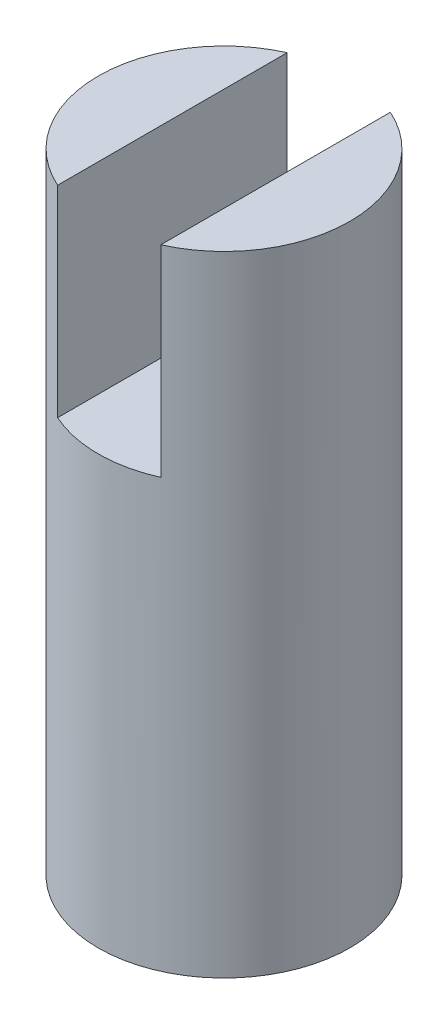
ISO-10303-21;
HEADER;
FILE_DESCRIPTION(('STEP AP214'),'2;1');
FILE_NAME('part.step','',(''),(''),'','','');
FILE_SCHEMA(('AUTOMOTIVE_DESIGN { 1 0 10303 214 1 1 1 1 }'));
ENDSEC;
DATA;
#1=APPLICATION_CONTEXT('core data for automotive mechanical design processes');
#2=APPLICATION_PROTOCOL_DEFINITION('international standard','automotive_design',2000,#1);
#3=PRODUCT_CONTEXT('',#1,'mechanical');
#4=PRODUCT('Part','Part','',(#3));
#5=PRODUCT_RELATED_PRODUCT_CATEGORY('part','',(#4));
#6=PRODUCT_DEFINITION_FORMATION('','',#4);
#7=PRODUCT_DEFINITION_CONTEXT('part definition',#1,'design');
#8=PRODUCT_DEFINITION('design','',#6,#7);
#9=PRODUCT_DEFINITION_SHAPE('','',#8);
#10=(LENGTH_UNIT() NAMED_UNIT(*) SI_UNIT(.MILLI.,.METRE.));
#11=(NAMED_UNIT(*) PLANE_ANGLE_UNIT() SI_UNIT($,.RADIAN.));
#12=(NAMED_UNIT(*) SI_UNIT($,.STERADIAN.) SOLID_ANGLE_UNIT());
#13=UNCERTAINTY_MEASURE_WITH_UNIT(LENGTH_MEASURE(1.E-05),#10,'distance_accuracy_value','');
#14=(GEOMETRIC_REPRESENTATION_CONTEXT(3) GLOBAL_UNCERTAINTY_ASSIGNED_CONTEXT((#13)) GLOBAL_UNIT_ASSIGNED_CONTEXT((#10,
#11,#12)) REPRESENTATION_CONTEXT('',''));
#15=CARTESIAN_POINT('',(0.,0.,0.));
#16=DIRECTION('',(0.,0.,1.));
#17=DIRECTION('',(1.,0.,0.));
#18=AXIS2_PLACEMENT_3D('',#15,#16,#17);
#19=CARTESIAN_POINT('',(0.,25.,0.));
#20=DIRECTION('',(0.,1.,0.));
#21=DIRECTION('',(0.,0.,1.));
#22=AXIS2_PLACEMENT_3D('',#19,#20,#21);
#23=PLANE('',#22);
#24=DIRECTION('',(0.,0.,-1.));
#25=VECTOR('',#24,1.);
#26=CARTESIAN_POINT('',(2.05,25.,0.));
#27=LINE('',#26,#25);
#28=CARTESIAN_POINT('',(2.05,25.,4.56042761152943));
#29=VERTEX_POINT('',#28);
#30=CARTESIAN_POINT('',(2.05,25.,-4.56042761152943));
#31=VERTEX_POINT('',#30);
#32=EDGE_CURVE('E158',#29,#31,#27,.T.);
#33=ORIENTED_EDGE('',*,*,#32,.F.);
#34=CARTESIAN_POINT('',(0.,25.,0.));
#35=DIRECTION('',(0.,1.,0.));
#36=DIRECTION('',(0.,0.,1.));
#37=AXIS2_PLACEMENT_3D('',#34,#35,#36);
#38=CIRCLE('',#37,5.);
#39=EDGE_CURVE('E151',#29,#31,#38,.T.);
#40=ORIENTED_EDGE('',*,*,#39,.T.);
#41=EDGE_LOOP('',(#33,#40));
#42=FACE_BOUND('',#41,.T.);
#43=ADVANCED_FACE('F33',(#42),#23,.T.);
#44=CARTESIAN_POINT('',(0.,25.,0.));
#45=DIRECTION('',(0.,-1.,0.));
#46=DIRECTION('',(0.,0.,-1.));
#47=AXIS2_PLACEMENT_3D('',#44,#45,#46);
#48=CYLINDRICAL_SURFACE('',#47,5.);
#49=CARTESIAN_POINT('',(0.,17.,0.));
#50=DIRECTION('',(0.,1.,0.));
#51=DIRECTION('',(0.,0.,1.));
#52=AXIS2_PLACEMENT_3D('',#49,#50,#51);
#53=CIRCLE('',#52,5.);
#54=CARTESIAN_POINT('',(2.05,17.,-4.56042761152943));
#55=VERTEX_POINT('',#54);
#56=CARTESIAN_POINT('',(-2.05,17.,-4.56042761152943));
#57=VERTEX_POINT('',#56);
#58=EDGE_CURVE('E11',#55,#57,#53,.T.);
#59=ORIENTED_EDGE('',*,*,#58,.F.);
#60=DIRECTION('',(0.,-1.,0.));
#61=VECTOR('',#60,1.);
#62=CARTESIAN_POINT('',(2.05,25.,-4.56042761152943));
#63=LINE('',#62,#61);
#64=EDGE_CURVE('E144',#55,#31,#63,.F.);
#65=ORIENTED_EDGE('',*,*,#64,.T.);
#66=ORIENTED_EDGE('',*,*,#39,.F.);
#67=DIRECTION('',(0.,-1.,0.));
#68=VECTOR('',#67,1.);
#69=CARTESIAN_POINT('',(2.05,25.,4.56042761152943));
#70=LINE('',#69,#68);
#71=CARTESIAN_POINT('',(2.05,17.,4.56042761152943));
#72=VERTEX_POINT('',#71);
#73=EDGE_CURVE('E147',#29,#72,#70,.T.);
#74=ORIENTED_EDGE('',*,*,#73,.T.);
#75=CARTESIAN_POINT('',(-2.05,17.,4.56042761152943));
#76=VERTEX_POINT('',#75);
#77=EDGE_CURVE('E37',#76,#72,#53,.T.);
#78=ORIENTED_EDGE('',*,*,#77,.F.);
#79=DIRECTION('',(0.,-1.,0.));
#80=VECTOR('',#79,1.);
#81=CARTESIAN_POINT('',(-2.05,25.,4.56042761152943));
#82=LINE('',#81,#80);
#83=CARTESIAN_POINT('',(-2.05,25.,4.56042761152943));
#84=VERTEX_POINT('',#83);
#85=EDGE_CURVE('E140',#76,#84,#82,.F.);
#86=ORIENTED_EDGE('',*,*,#85,.T.);
#87=CARTESIAN_POINT('',(-2.05,25.,-4.56042761152943));
#88=VERTEX_POINT('',#87);
#89=EDGE_CURVE('E155',#88,#84,#38,.T.);
#90=ORIENTED_EDGE('',*,*,#89,.F.);
#91=DIRECTION('',(0.,-1.,0.));
#92=VECTOR('',#91,1.);
#93=CARTESIAN_POINT('',(-2.05,25.,-4.56042761152943));
#94=LINE('',#93,#92);
#95=EDGE_CURVE('E56',#88,#57,#94,.T.);
#96=ORIENTED_EDGE('',*,*,#95,.T.);
#97=EDGE_LOOP('',(#59,#65,#66,#74,#78,#86,#90,#96));
#98=FACE_BOUND('',#97,.T.);
#99=CARTESIAN_POINT('',(0.,0.,0.));
#100=DIRECTION('',(0.,1.,0.));
#101=DIRECTION('',(0.,0.,1.));
#102=AXIS2_PLACEMENT_3D('',#99,#100,#101);
#103=CIRCLE('',#102,5.);
#104=CARTESIAN_POINT('',(0.,0.,5.));
#105=VERTEX_POINT('',#104);
#106=EDGE_CURVE('E150',#105,#105,#103,.T.);
#107=ORIENTED_EDGE('',*,*,#106,.T.);
#108=EDGE_LOOP('',(#107));
#109=FACE_BOUND('',#108,.T.);
#110=ADVANCED_FACE('F35',(#98,#109),#48,.T.);
#111=DIRECTION('',(0.,0.,1.));
#112=VECTOR('',#111,1.);
#113=CARTESIAN_POINT('',(-2.05,25.,0.));
#114=LINE('',#113,#112);
#115=EDGE_CURVE('E154',#88,#84,#114,.T.);
#116=ORIENTED_EDGE('',*,*,#115,.F.);
#117=ORIENTED_EDGE('',*,*,#89,.T.);
#118=EDGE_LOOP('',(#116,#117));
#119=FACE_BOUND('',#118,.T.);
#120=ADVANCED_FACE('F173',(#119),#23,.T.);
#121=CARTESIAN_POINT('',(0.,0.,0.));
#122=DIRECTION('',(0.,1.,0.));
#123=DIRECTION('',(0.,0.,1.));
#124=AXIS2_PLACEMENT_3D('',#121,#122,#123);
#125=PLANE('',#124);
#126=CARTESIAN_POINT('',(0.,0.,0.));
#127=DIRECTION('',(0.,-1.,0.));
#128=DIRECTION('',(0.,0.,-1.));
#129=AXIS2_PLACEMENT_3D('',#126,#127,#128);
#130=CIRCLE('',#129,3.05);
#131=CARTESIAN_POINT('',(-2.3,0.,-2.00312256240101));
#132=VERTEX_POINT('',#131);
#133=CARTESIAN_POINT('',(2.3,0.,-2.00312256240101));
#134=VERTEX_POINT('',#133);
#135=EDGE_CURVE('E123',#132,#134,#130,.T.);
#136=ORIENTED_EDGE('',*,*,#135,.F.);
#137=DIRECTION('',(0.,0.,-1.));
#138=VECTOR('',#137,1.);
#139=CARTESIAN_POINT('',(-2.3,0.,0.));
#140=LINE('',#139,#138);
#141=CARTESIAN_POINT('',(-2.3,0.,2.00312256240101));
#142=VERTEX_POINT('',#141);
#143=EDGE_CURVE('E48',#142,#132,#140,.T.);
#144=ORIENTED_EDGE('',*,*,#143,.F.);
#145=CARTESIAN_POINT('',(2.3,0.,2.00312256240101));
#146=VERTEX_POINT('',#145);
#147=EDGE_CURVE('E118',#146,#142,#130,.T.);
#148=ORIENTED_EDGE('',*,*,#147,.F.);
#149=DIRECTION('',(0.,0.,-1.));
#150=VECTOR('',#149,1.);
#151=CARTESIAN_POINT('',(2.3,0.,0.));
#152=LINE('',#151,#150);
#153=EDGE_CURVE('E121',#146,#134,#152,.T.);
#154=ORIENTED_EDGE('',*,*,#153,.T.);
#155=EDGE_LOOP('',(#136,#144,#148,#154));
#156=FACE_BOUND('',#155,.T.);
#157=ORIENTED_EDGE('',*,*,#106,.F.);
#158=EDGE_LOOP('',(#157));
#159=FACE_BOUND('',#158,.T.);
#160=ADVANCED_FACE('F179',(#156,#159),#125,.F.);
#161=CARTESIAN_POINT('',(0.,17.,0.));
#162=DIRECTION('',(0.,1.,0.));
#163=DIRECTION('',(0.,0.,1.));
#164=AXIS2_PLACEMENT_3D('',#161,#162,#163);
#165=PLANE('',#164);
#166=ORIENTED_EDGE('',*,*,#58,.T.);
#167=DIRECTION('',(0.,0.,1.));
#168=VECTOR('',#167,1.);
#169=CARTESIAN_POINT('',(-2.05,17.,-5.24793317822514));
#170=LINE('',#169,#168);
#171=EDGE_CURVE('E137',#57,#76,#170,.T.);
#172=ORIENTED_EDGE('',*,*,#171,.T.);
#173=ORIENTED_EDGE('',*,*,#77,.T.);
#174=DIRECTION('',(0.,0.,-1.));
#175=VECTOR('',#174,1.);
#176=CARTESIAN_POINT('',(2.05,17.,-5.24793317822514));
#177=LINE('',#176,#175);
#178=EDGE_CURVE('E131',#72,#55,#177,.T.);
#179=ORIENTED_EDGE('',*,*,#178,.T.);
#180=EDGE_LOOP('',(#166,#172,#173,#179));
#181=FACE_BOUND('',#180,.T.);
#182=ADVANCED_FACE('F164',(#181),#165,.T.);
#183=CARTESIAN_POINT('',(2.05,17.,-5.24793317822514));
#184=DIRECTION('',(1.,0.,0.));
#185=DIRECTION('',(0.,0.,-1.));
#186=AXIS2_PLACEMENT_3D('',#183,#184,#185);
#187=PLANE('',#186);
#188=ORIENTED_EDGE('',*,*,#32,.T.);
#189=ORIENTED_EDGE('',*,*,#64,.F.);
#190=ORIENTED_EDGE('',*,*,#178,.F.);
#191=ORIENTED_EDGE('',*,*,#73,.F.);
#192=EDGE_LOOP('',(#188,#189,#190,#191));
#193=FACE_BOUND('',#192,.T.);
#194=ADVANCED_FACE('F167',(#193),#187,.F.);
#195=CARTESIAN_POINT('',(-2.05,17.,-5.24793317822514));
#196=DIRECTION('',(-1.,0.,0.));
#197=DIRECTION('',(0.,0.,1.));
#198=AXIS2_PLACEMENT_3D('',#195,#196,#197);
#199=PLANE('',#198);
#200=ORIENTED_EDGE('',*,*,#115,.T.);
#201=ORIENTED_EDGE('',*,*,#85,.F.);
#202=ORIENTED_EDGE('',*,*,#171,.F.);
#203=ORIENTED_EDGE('',*,*,#95,.F.);
#204=EDGE_LOOP('',(#200,#201,#202,#203));
#205=FACE_BOUND('',#204,.T.);
#206=ADVANCED_FACE('F187',(#205),#199,.F.);
#207=CARTESIAN_POINT('',(-2.3,10.,0.));
#208=DIRECTION('',(-1.,0.,0.));
#209=DIRECTION('',(0.,0.,1.));
#210=AXIS2_PLACEMENT_3D('',#207,#208,#209);
#211=PLANE('',#210);
#212=ORIENTED_EDGE('',*,*,#143,.T.);
#213=DIRECTION('',(0.,-1.,0.));
#214=VECTOR('',#213,1.);
#215=CARTESIAN_POINT('',(-2.3,10.,-2.00312256240101));
#216=LINE('',#215,#214);
#217=CARTESIAN_POINT('',(-2.3,10.,-2.00312256240101));
#218=VERTEX_POINT('',#217);
#219=EDGE_CURVE('E96',#218,#132,#216,.T.);
#220=ORIENTED_EDGE('',*,*,#219,.F.);
#221=DIRECTION('',(0.,0.,-1.));
#222=VECTOR('',#221,1.);
#223=CARTESIAN_POINT('',(-2.3,10.,0.));
#224=LINE('',#223,#222);
#225=CARTESIAN_POINT('',(-2.3,10.,2.00312256240101));
#226=VERTEX_POINT('',#225);
#227=EDGE_CURVE('E100',#226,#218,#224,.T.);
#228=ORIENTED_EDGE('',*,*,#227,.F.);
#229=DIRECTION('',(0.,-1.,0.));
#230=VECTOR('',#229,1.);
#231=CARTESIAN_POINT('',(-2.3,10.,2.00312256240101));
#232=LINE('',#231,#230);
#233=EDGE_CURVE('E129',#226,#142,#232,.T.);
#234=ORIENTED_EDGE('',*,*,#233,.T.);
#235=EDGE_LOOP('',(#212,#220,#228,#234));
#236=FACE_BOUND('',#235,.T.);
#237=ADVANCED_FACE('F98',(#236),#211,.F.);
#238=CARTESIAN_POINT('',(0.,10.,0.));
#239=DIRECTION('',(0.,-1.,0.));
#240=DIRECTION('',(0.,0.,-1.));
#241=AXIS2_PLACEMENT_3D('',#238,#239,#240);
#242=CYLINDRICAL_SURFACE('',#241,3.05);
#243=ORIENTED_EDGE('',*,*,#147,.T.);
#244=ORIENTED_EDGE('',*,*,#233,.F.);
#245=CARTESIAN_POINT('',(0.,10.,0.));
#246=DIRECTION('',(0.,-1.,0.));
#247=DIRECTION('',(0.,0.,-1.));
#248=AXIS2_PLACEMENT_3D('',#245,#246,#247);
#249=CIRCLE('',#248,3.05);
#250=CARTESIAN_POINT('',(2.3,10.,2.00312256240101));
#251=VERTEX_POINT('',#250);
#252=EDGE_CURVE('E106',#251,#226,#249,.T.);
#253=ORIENTED_EDGE('',*,*,#252,.F.);
#254=DIRECTION('',(0.,-1.,0.));
#255=VECTOR('',#254,1.);
#256=CARTESIAN_POINT('',(2.3,10.,2.00312256240101));
#257=LINE('',#256,#255);
#258=EDGE_CURVE('E132',#251,#146,#257,.T.);
#259=ORIENTED_EDGE('',*,*,#258,.T.);
#260=EDGE_LOOP('',(#243,#244,#253,#259));
#261=FACE_BOUND('',#260,.T.);
#262=ADVANCED_FACE('F194',(#261),#242,.F.);
#263=CARTESIAN_POINT('',(2.3,10.,0.));
#264=DIRECTION('',(-1.,0.,0.));
#265=DIRECTION('',(0.,0.,1.));
#266=AXIS2_PLACEMENT_3D('',#263,#264,#265);
#267=PLANE('',#266);
#268=ORIENTED_EDGE('',*,*,#153,.F.);
#269=ORIENTED_EDGE('',*,*,#258,.F.);
#270=DIRECTION('',(0.,0.,-1.));
#271=VECTOR('',#270,1.);
#272=CARTESIAN_POINT('',(2.3,10.,0.));
#273=LINE('',#272,#271);
#274=CARTESIAN_POINT('',(2.3,10.,-2.00312256240101));
#275=VERTEX_POINT('',#274);
#276=EDGE_CURVE('E114',#251,#275,#273,.T.);
#277=ORIENTED_EDGE('',*,*,#276,.T.);
#278=DIRECTION('',(0.,-1.,0.));
#279=VECTOR('',#278,1.);
#280=CARTESIAN_POINT('',(2.3,10.,-2.00312256240101));
#281=LINE('',#280,#279);
#282=EDGE_CURVE('E105',#275,#134,#281,.T.);
#283=ORIENTED_EDGE('',*,*,#282,.T.);
#284=EDGE_LOOP('',(#268,#269,#277,#283));
#285=FACE_BOUND('',#284,.T.);
#286=ADVANCED_FACE('F199',(#285),#267,.T.);
#287=ORIENTED_EDGE('',*,*,#135,.T.);
#288=ORIENTED_EDGE('',*,*,#282,.F.);
#289=EDGE_CURVE('E110',#218,#275,#249,.T.);
#290=ORIENTED_EDGE('',*,*,#289,.F.);
#291=ORIENTED_EDGE('',*,*,#219,.T.);
#292=EDGE_LOOP('',(#287,#288,#290,#291));
#293=FACE_BOUND('',#292,.T.);
#294=ADVANCED_FACE('F111',(#293),#242,.F.);
#295=CARTESIAN_POINT('',(0.,10.,0.));
#296=DIRECTION('',(0.,-1.,0.));
#297=DIRECTION('',(0.,0.,-1.));
#298=AXIS2_PLACEMENT_3D('',#295,#296,#297);
#299=PLANE('',#298);
#300=ORIENTED_EDGE('',*,*,#227,.T.);
#301=ORIENTED_EDGE('',*,*,#289,.T.);
#302=ORIENTED_EDGE('',*,*,#276,.F.);
#303=ORIENTED_EDGE('',*,*,#252,.T.);
#304=EDGE_LOOP('',(#300,#301,#302,#303));
#305=FACE_BOUND('',#304,.T.);
#306=ADVANCED_FACE('F116',(#305),#299,.T.);
#307=CLOSED_SHELL('',(#43,#110,#120,#160,#182,#194,#206,#237,#262,#286,#294,#306));
#308=MANIFOLD_SOLID_BREP('B2',#307);
#309=ADVANCED_BREP_SHAPE_REPRESENTATION('',(#18,#308),#14);
#310=SHAPE_DEFINITION_REPRESENTATION(#9,#309);
ENDSEC;
END-ISO-10303-21;
